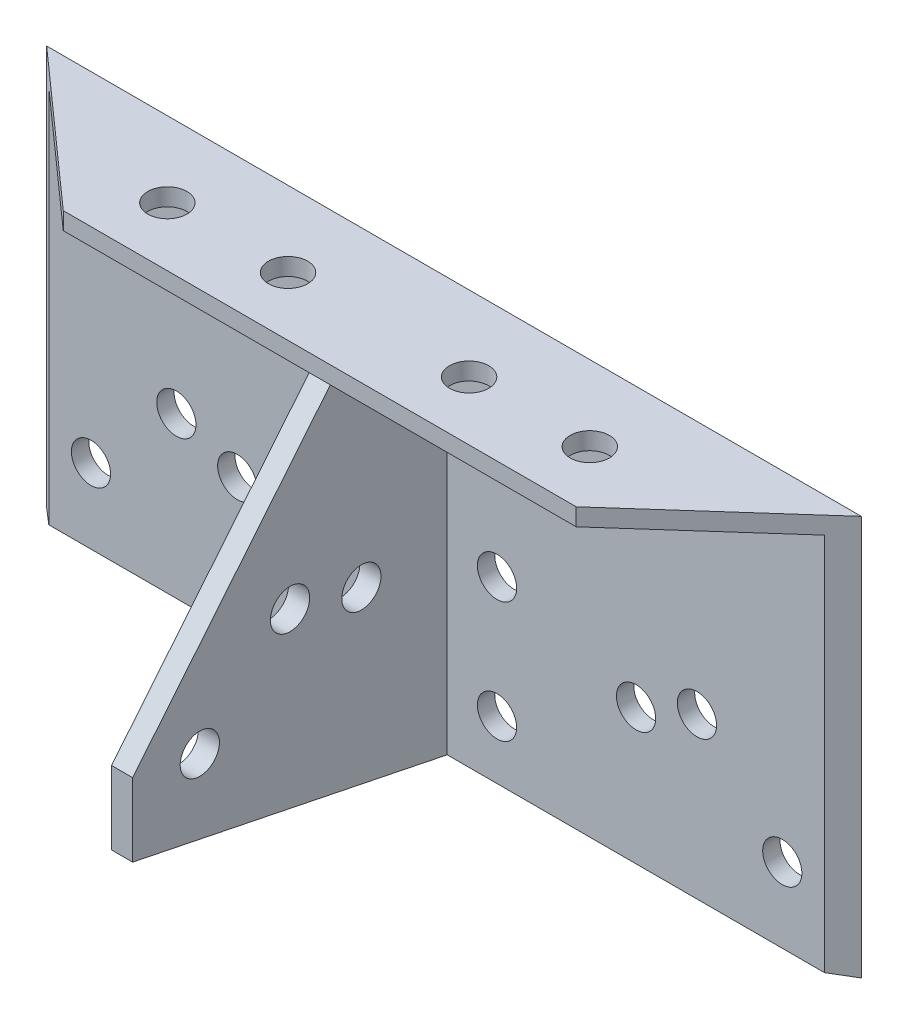
ISO-10303-21;
HEADER;
FILE_DESCRIPTION(('STEP AP214'),'2;1');
FILE_NAME('part.step','',(''),(''),'','','');
FILE_SCHEMA(('AUTOMOTIVE_DESIGN { 1 0 10303 214 1 1 1 1 }'));
ENDSEC;
DATA;
#1=APPLICATION_CONTEXT('core data for automotive mechanical design processes');
#2=APPLICATION_PROTOCOL_DEFINITION('international standard','automotive_design',2000,#1);
#3=PRODUCT_CONTEXT('',#1,'mechanical');
#4=PRODUCT('Part','Part','',(#3));
#5=PRODUCT_RELATED_PRODUCT_CATEGORY('part','',(#4));
#6=PRODUCT_DEFINITION_FORMATION('','',#4);
#7=PRODUCT_DEFINITION_CONTEXT('part definition',#1,'design');
#8=PRODUCT_DEFINITION('design','',#6,#7);
#9=PRODUCT_DEFINITION_SHAPE('','',#8);
#10=(LENGTH_UNIT() NAMED_UNIT(*) SI_UNIT(.MILLI.,.METRE.));
#11=(NAMED_UNIT(*) PLANE_ANGLE_UNIT() SI_UNIT($,.RADIAN.));
#12=(NAMED_UNIT(*) SI_UNIT($,.STERADIAN.) SOLID_ANGLE_UNIT());
#13=UNCERTAINTY_MEASURE_WITH_UNIT(LENGTH_MEASURE(1.E-05),#10,'distance_accuracy_value','');
#14=(GEOMETRIC_REPRESENTATION_CONTEXT(3) GLOBAL_UNCERTAINTY_ASSIGNED_CONTEXT((#13)) GLOBAL_UNIT_ASSIGNED_CONTEXT((#10,
#11,#12)) REPRESENTATION_CONTEXT('',''));
#15=CARTESIAN_POINT('',(0.,0.,0.));
#16=DIRECTION('',(0.,0.,1.));
#17=DIRECTION('',(1.,0.,0.));
#18=AXIS2_PLACEMENT_3D('',#15,#16,#17);
#19=CARTESIAN_POINT('',(0.,265.,11.5));
#20=DIRECTION('',(0.,0.,-1.));
#21=DIRECTION('',(-1.,0.,0.));
#22=AXIS2_PLACEMENT_3D('',#19,#20,#21);
#23=PLANE('',#22);
#24=CARTESIAN_POINT('',(97.4659453904821,108.465945390483,11.5));
#25=DIRECTION('',(0.,0.,1.));
#26=DIRECTION('',(1.,0.,0.));
#27=AXIS2_PLACEMENT_3D('',#24,#25,#26);
#28=CIRCLE('',#27,13.);
#29=CARTESIAN_POINT('',(110.465945390482,108.465945390483,11.5));
#30=VERTEX_POINT('',#29);
#31=EDGE_CURVE('E288',#30,#30,#28,.T.);
#32=ORIENTED_EDGE('',*,*,#31,.F.);
#33=EDGE_LOOP('',(#32));
#34=FACE_BOUND('',#33,.T.);
#35=CARTESIAN_POINT('',(40.8974028955581,51.897402895559,11.5));
#36=DIRECTION('',(0.,0.,1.));
#37=DIRECTION('',(1.,0.,0.));
#38=AXIS2_PLACEMENT_3D('',#35,#36,#37);
#39=CIRCLE('',#38,13.);
#40=CARTESIAN_POINT('',(53.8974028955582,51.897402895559,11.5));
#41=VERTEX_POINT('',#40);
#42=EDGE_CURVE('E282',#41,#41,#39,.T.);
#43=ORIENTED_EDGE('',*,*,#42,.F.);
#44=EDGE_LOOP('',(#43));
#45=FACE_BOUND('',#44,.T.);
#46=CARTESIAN_POINT('',(230.,121.,11.5));
#47=DIRECTION('',(0.,0.,1.));
#48=DIRECTION('',(1.,0.,0.));
#49=AXIS2_PLACEMENT_3D('',#46,#47,#48);
#50=CIRCLE('',#49,13.);
#51=CARTESIAN_POINT('',(243.,121.,11.5));
#52=VERTEX_POINT('',#51);
#53=EDGE_CURVE('E270',#52,#52,#50,.T.);
#54=ORIENTED_EDGE('',*,*,#53,.F.);
#55=EDGE_LOOP('',(#54));
#56=FACE_BOUND('',#55,.T.);
#57=CARTESIAN_POINT('',(230.,41.,11.5));
#58=DIRECTION('',(0.,0.,1.));
#59=DIRECTION('',(1.,0.,0.));
#60=AXIS2_PLACEMENT_3D('',#57,#58,#59);
#61=CIRCLE('',#60,13.);
#62=CARTESIAN_POINT('',(243.,41.,11.5));
#63=VERTEX_POINT('',#62);
#64=EDGE_CURVE('E264',#63,#63,#61,.T.);
#65=ORIENTED_EDGE('',*,*,#64,.F.);
#66=EDGE_LOOP('',(#65));
#67=FACE_BOUND('',#66,.T.);
#68=CARTESIAN_POINT('',(137.829012361263,92.2615340814046,11.5));
#69=DIRECTION('',(0.,0.,1.));
#70=DIRECTION('',(1.,0.,0.));
#71=AXIS2_PLACEMENT_3D('',#68,#69,#70);
#72=CIRCLE('',#71,13.);
#73=CARTESIAN_POINT('',(150.829012361263,92.2615340814046,11.5));
#74=VERTEX_POINT('',#73);
#75=EDGE_CURVE('E246',#74,#74,#72,.T.);
#76=ORIENTED_EDGE('',*,*,#75,.F.);
#77=EDGE_LOOP('',(#76));
#78=FACE_BOUND('',#77,.T.);
#79=DIRECTION('',(0.,-1.,0.));
#80=VECTOR('',#79,1.);
#81=CARTESIAN_POINT('',(12.9213483146067,265.,11.5));
#82=LINE('',#81,#80);
#83=CARTESIAN_POINT('',(12.9213483146067,253.5,11.5));
#84=VERTEX_POINT('',#83);
#85=CARTESIAN_POINT('',(12.9213483146067,2.35227272727279,11.5));
#86=VERTEX_POINT('',#85);
#87=EDGE_CURVE('E219',#84,#86,#82,.T.);
#88=ORIENTED_EDGE('',*,*,#87,.T.);
#89=DIRECTION('',(1.,0.,0.));
#90=VECTOR('',#89,1.);
#91=CARTESIAN_POINT('',(0.,2.35227272727279,11.5));
#92=LINE('',#91,#90);
#93=CARTESIAN_POINT('',(263.,2.35227272727273,11.5));
#94=VERTEX_POINT('',#93);
#95=EDGE_CURVE('E320',#86,#94,#92,.T.);
#96=ORIENTED_EDGE('',*,*,#95,.T.);
#97=DIRECTION('',(0.,-1.,0.));
#98=VECTOR('',#97,1.);
#99=CARTESIAN_POINT('',(263.,253.5,11.5));
#100=LINE('',#99,#98);
#101=CARTESIAN_POINT('',(263.,253.5,11.5));
#102=VERTEX_POINT('',#101);
#103=EDGE_CURVE('E193',#102,#94,#100,.T.);
#104=ORIENTED_EDGE('',*,*,#103,.F.);
#105=DIRECTION('',(1.,0.,0.));
#106=VECTOR('',#105,1.);
#107=CARTESIAN_POINT('',(0.,253.5,11.5));
#108=LINE('',#107,#106);
#109=EDGE_CURVE('E231',#84,#102,#108,.T.);
#110=ORIENTED_EDGE('',*,*,#109,.F.);
#111=EDGE_LOOP('',(#88,#96,#104,#110));
#112=FACE_BOUND('',#111,.T.);
#113=ADVANCED_FACE('F35',(#34,#45,#56,#67,#78,#112),#23,.F.);
#114=CARTESIAN_POINT('',(499.102597104442,51.8974028955591,11.5));
#115=DIRECTION('',(0.,0.,1.));
#116=DIRECTION('',(-1.,0.,0.));
#117=AXIS2_PLACEMENT_3D('',#114,#115,#116);
#118=CIRCLE('',#117,13.0000000000001);
#119=CARTESIAN_POINT('',(486.102597104442,51.8974028955591,11.5));
#120=VERTEX_POINT('',#119);
#121=EDGE_CURVE('E276',#120,#120,#118,.T.);
#122=ORIENTED_EDGE('',*,*,#121,.F.);
#123=EDGE_LOOP('',(#122));
#124=FACE_BOUND('',#123,.T.);
#125=CARTESIAN_POINT('',(310.,41.,11.5));
#126=DIRECTION('',(0.,0.,1.));
#127=DIRECTION('',(-1.,0.,0.));
#128=AXIS2_PLACEMENT_3D('',#125,#126,#127);
#129=CIRCLE('',#128,13.);
#130=CARTESIAN_POINT('',(297.,41.,11.5));
#131=VERTEX_POINT('',#130);
#132=EDGE_CURVE('E258',#131,#131,#129,.T.);
#133=ORIENTED_EDGE('',*,*,#132,.F.);
#134=EDGE_LOOP('',(#133));
#135=FACE_BOUND('',#134,.T.);
#136=CARTESIAN_POINT('',(310.,121.,11.5));
#137=DIRECTION('',(0.,0.,1.));
#138=DIRECTION('',(-1.,0.,0.));
#139=AXIS2_PLACEMENT_3D('',#136,#137,#138);
#140=CIRCLE('',#139,13.);
#141=CARTESIAN_POINT('',(297.,121.,11.5));
#142=VERTEX_POINT('',#141);
#143=EDGE_CURVE('E252',#142,#142,#140,.T.);
#144=ORIENTED_EDGE('',*,*,#143,.F.);
#145=EDGE_LOOP('',(#144));
#146=FACE_BOUND('',#145,.T.);
#147=CARTESIAN_POINT('',(442.534054609518,108.465945390483,11.5));
#148=DIRECTION('',(0.,0.,1.));
#149=DIRECTION('',(-1.,0.,0.));
#150=AXIS2_PLACEMENT_3D('',#147,#148,#149);
#151=CIRCLE('',#150,13.);
#152=CARTESIAN_POINT('',(429.534054609518,108.465945390483,11.5));
#153=VERTEX_POINT('',#152);
#154=EDGE_CURVE('E240',#153,#153,#151,.T.);
#155=ORIENTED_EDGE('',*,*,#154,.F.);
#156=EDGE_LOOP('',(#155));
#157=FACE_BOUND('',#156,.T.);
#158=CARTESIAN_POINT('',(402.170987638737,92.2615340814046,11.5));
#159=DIRECTION('',(0.,0.,1.));
#160=DIRECTION('',(-1.,0.,0.));
#161=AXIS2_PLACEMENT_3D('',#158,#159,#160);
#162=CIRCLE('',#161,13.);
#163=CARTESIAN_POINT('',(389.170987638737,92.2615340814046,11.5));
#164=VERTEX_POINT('',#163);
#165=EDGE_CURVE('E234',#164,#164,#162,.T.);
#166=ORIENTED_EDGE('',*,*,#165,.F.);
#167=EDGE_LOOP('',(#166));
#168=FACE_BOUND('',#167,.T.);
#169=DIRECTION('',(0.,1.,0.));
#170=VECTOR('',#169,1.);
#171=CARTESIAN_POINT('',(277.,253.5,11.5));
#172=LINE('',#171,#170);
#173=CARTESIAN_POINT('',(277.,2.35227272727274,11.5000000000001));
#174=VERTEX_POINT('',#173);
#175=CARTESIAN_POINT('',(277.,253.5,11.5));
#176=VERTEX_POINT('',#175);
#177=EDGE_CURVE('E189',#174,#176,#172,.T.);
#178=ORIENTED_EDGE('',*,*,#177,.F.);
#179=DIRECTION('',(-1.,0.,0.));
#180=VECTOR('',#179,1.);
#181=CARTESIAN_POINT('',(540.,2.35227272727274,11.5000000000001));
#182=LINE('',#181,#180);
#183=CARTESIAN_POINT('',(527.078651685393,2.35227272727274,11.5000000000001));
#184=VERTEX_POINT('',#183);
#185=EDGE_CURVE('E136',#184,#174,#182,.T.);
#186=ORIENTED_EDGE('',*,*,#185,.F.);
#187=DIRECTION('',(0.,1.,0.));
#188=VECTOR('',#187,1.);
#189=CARTESIAN_POINT('',(527.078651685393,265.,11.5));
#190=LINE('',#189,#188);
#191=CARTESIAN_POINT('',(527.078651685393,253.5,11.5));
#192=VERTEX_POINT('',#191);
#193=EDGE_CURVE('E134',#184,#192,#190,.T.);
#194=ORIENTED_EDGE('',*,*,#193,.T.);
#195=EDGE_CURVE('E222',#176,#192,#108,.T.);
#196=ORIENTED_EDGE('',*,*,#195,.F.);
#197=EDGE_LOOP('',(#178,#186,#194,#196));
#198=FACE_BOUND('',#197,.T.);
#199=ADVANCED_FACE('F308',(#124,#135,#146,#157,#168,#198),#23,.F.);
#200=CARTESIAN_POINT('',(0.,253.5,89.));
#201=DIRECTION('',(0.,1.,0.));
#202=DIRECTION('',(0.,0.,1.));
#203=AXIS2_PLACEMENT_3D('',#200,#201,#202);
#204=PLANE('',#203);
#205=CARTESIAN_POINT('',(210.,253.5,50.));
#206=DIRECTION('',(0.,1.,0.));
#207=DIRECTION('',(0.,0.,1.));
#208=AXIS2_PLACEMENT_3D('',#205,#206,#207);
#209=CIRCLE('',#208,13.);
#210=CARTESIAN_POINT('',(210.,253.5,63.));
#211=VERTEX_POINT('',#210);
#212=EDGE_CURVE('E153',#211,#211,#209,.T.);
#213=ORIENTED_EDGE('',*,*,#212,.T.);
#214=EDGE_LOOP('',(#213));
#215=FACE_BOUND('',#214,.T.);
#216=CARTESIAN_POINT('',(130.,253.5,50.));
#217=DIRECTION('',(0.,1.,0.));
#218=DIRECTION('',(0.,0.,1.));
#219=AXIS2_PLACEMENT_3D('',#216,#217,#218);
#220=CIRCLE('',#219,13.);
#221=CARTESIAN_POINT('',(130.,253.5,63.));
#222=VERTEX_POINT('',#221);
#223=EDGE_CURVE('E165',#222,#222,#220,.T.);
#224=ORIENTED_EDGE('',*,*,#223,.T.);
#225=EDGE_LOOP('',(#224));
#226=FACE_BOUND('',#225,.T.);
#227=DIRECTION('',(0.,0.,-1.));
#228=VECTOR('',#227,1.);
#229=CARTESIAN_POINT('',(263.,253.5,220.));
#230=LINE('',#229,#228);
#231=CARTESIAN_POINT('',(263.,253.5,89.));
#232=VERTEX_POINT('',#231);
#233=EDGE_CURVE('E185',#232,#102,#230,.T.);
#234=ORIENTED_EDGE('',*,*,#233,.F.);
#235=DIRECTION('',(1.,0.,0.));
#236=VECTOR('',#235,1.);
#237=CARTESIAN_POINT('',(0.,253.5,89.));
#238=LINE('',#237,#236);
#239=CARTESIAN_POINT('',(100.,253.5,89.));
#240=VERTEX_POINT('',#239);
#241=EDGE_CURVE('E223',#240,#232,#238,.T.);
#242=ORIENTED_EDGE('',*,*,#241,.F.);
#243=DIRECTION('',(-0.746997038573461,0.,-0.66482736433038));
#244=VECTOR('',#243,1.);
#245=CARTESIAN_POINT('',(44.199542436248,253.5,39.3375927682607));
#246=LINE('',#245,#244);
#247=EDGE_CURVE('E216',#240,#84,#246,.T.);
#248=ORIENTED_EDGE('',*,*,#247,.T.);
#249=ORIENTED_EDGE('',*,*,#109,.T.);
#250=EDGE_LOOP('',(#234,#242,#248,#249));
#251=FACE_BOUND('',#250,.T.);
#252=ADVANCED_FACE('F355',(#215,#226,#251),#204,.F.);
#253=CARTESIAN_POINT('',(330.,253.5,50.));
#254=DIRECTION('',(0.,1.,0.));
#255=DIRECTION('',(0.,0.,1.));
#256=AXIS2_PLACEMENT_3D('',#253,#254,#255);
#257=CIRCLE('',#256,13.);
#258=CARTESIAN_POINT('',(330.,253.5,62.9999999999999));
#259=VERTEX_POINT('',#258);
#260=EDGE_CURVE('E158',#259,#259,#257,.T.);
#261=ORIENTED_EDGE('',*,*,#260,.T.);
#262=EDGE_LOOP('',(#261));
#263=FACE_BOUND('',#262,.T.);
#264=CARTESIAN_POINT('',(410.,253.5,50.));
#265=DIRECTION('',(0.,1.,0.));
#266=DIRECTION('',(0.,0.,1.));
#267=AXIS2_PLACEMENT_3D('',#264,#265,#266);
#268=CIRCLE('',#267,13.);
#269=CARTESIAN_POINT('',(410.,253.5,63.));
#270=VERTEX_POINT('',#269);
#271=EDGE_CURVE('E161',#270,#270,#268,.T.);
#272=ORIENTED_EDGE('',*,*,#271,.T.);
#273=EDGE_LOOP('',(#272));
#274=FACE_BOUND('',#273,.T.);
#275=DIRECTION('',(0.,0.,-1.));
#276=VECTOR('',#275,1.);
#277=CARTESIAN_POINT('',(277.,253.5,220.));
#278=LINE('',#277,#276);
#279=CARTESIAN_POINT('',(277.,253.5,89.));
#280=VERTEX_POINT('',#279);
#281=EDGE_CURVE('E180',#280,#176,#278,.T.);
#282=ORIENTED_EDGE('',*,*,#281,.T.);
#283=ORIENTED_EDGE('',*,*,#195,.T.);
#284=DIRECTION('',(-0.746997038573461,0.,0.66482736433038));
#285=VECTOR('',#284,1.);
#286=CARTESIAN_POINT('',(194.477986719491,253.5,307.514591819653));
#287=LINE('',#286,#285);
#288=CARTESIAN_POINT('',(440.,253.5,89.));
#289=VERTEX_POINT('',#288);
#290=EDGE_CURVE('E210',#192,#289,#287,.T.);
#291=ORIENTED_EDGE('',*,*,#290,.T.);
#292=EDGE_CURVE('E228',#280,#289,#238,.T.);
#293=ORIENTED_EDGE('',*,*,#292,.F.);
#294=EDGE_LOOP('',(#282,#283,#291,#293));
#295=FACE_BOUND('',#294,.T.);
#296=ADVANCED_FACE('F303',(#263,#274,#295),#204,.F.);
#297=CARTESIAN_POINT('',(0.,265.,0.));
#298=DIRECTION('',(0.,0.,-1.));
#299=DIRECTION('',(-1.,0.,0.));
#300=AXIS2_PLACEMENT_3D('',#297,#298,#299);
#301=PLANE('',#300);
#302=CARTESIAN_POINT('',(442.534054609518,108.465945390483,0.));
#303=DIRECTION('',(0.,0.,1.));
#304=DIRECTION('',(-1.,0.,0.));
#305=AXIS2_PLACEMENT_3D('',#302,#303,#304);
#306=CIRCLE('',#305,13.);
#307=CARTESIAN_POINT('',(429.534054609518,108.465945390483,0.));
#308=VERTEX_POINT('',#307);
#309=EDGE_CURVE('E237',#308,#308,#306,.T.);
#310=ORIENTED_EDGE('',*,*,#309,.T.);
#311=EDGE_LOOP('',(#310));
#312=FACE_BOUND('',#311,.T.);
#313=CARTESIAN_POINT('',(310.,121.,0.));
#314=DIRECTION('',(0.,0.,1.));
#315=DIRECTION('',(-1.,0.,0.));
#316=AXIS2_PLACEMENT_3D('',#313,#314,#315);
#317=CIRCLE('',#316,13.);
#318=CARTESIAN_POINT('',(297.,121.,0.));
#319=VERTEX_POINT('',#318);
#320=EDGE_CURVE('E249',#319,#319,#317,.T.);
#321=ORIENTED_EDGE('',*,*,#320,.T.);
#322=EDGE_LOOP('',(#321));
#323=FACE_BOUND('',#322,.T.);
#324=CARTESIAN_POINT('',(230.,41.,0.));
#325=DIRECTION('',(0.,0.,1.));
#326=DIRECTION('',(1.,0.,0.));
#327=AXIS2_PLACEMENT_3D('',#324,#325,#326);
#328=CIRCLE('',#327,13.);
#329=CARTESIAN_POINT('',(243.,41.,0.));
#330=VERTEX_POINT('',#329);
#331=EDGE_CURVE('E261',#330,#330,#328,.T.);
#332=ORIENTED_EDGE('',*,*,#331,.T.);
#333=EDGE_LOOP('',(#332));
#334=FACE_BOUND('',#333,.T.);
#335=CARTESIAN_POINT('',(499.102597104442,51.8974028955591,0.));
#336=DIRECTION('',(0.,0.,1.));
#337=DIRECTION('',(-1.,0.,0.));
#338=AXIS2_PLACEMENT_3D('',#335,#336,#337);
#339=CIRCLE('',#338,13.0000000000001);
#340=CARTESIAN_POINT('',(486.102597104442,51.8974028955591,0.));
#341=VERTEX_POINT('',#340);
#342=EDGE_CURVE('E273',#341,#341,#339,.T.);
#343=ORIENTED_EDGE('',*,*,#342,.T.);
#344=EDGE_LOOP('',(#343));
#345=FACE_BOUND('',#344,.T.);
#346=CARTESIAN_POINT('',(97.4659453904821,108.465945390483,0.));
#347=DIRECTION('',(0.,0.,1.));
#348=DIRECTION('',(1.,0.,0.));
#349=AXIS2_PLACEMENT_3D('',#346,#347,#348);
#350=CIRCLE('',#349,13.);
#351=CARTESIAN_POINT('',(110.465945390482,108.465945390483,0.));
#352=VERTEX_POINT('',#351);
#353=EDGE_CURVE('E285',#352,#352,#350,.T.);
#354=ORIENTED_EDGE('',*,*,#353,.T.);
#355=EDGE_LOOP('',(#354));
#356=FACE_BOUND('',#355,.T.);
#357=DIRECTION('',(0.,-1.,0.));
#358=VECTOR('',#357,1.);
#359=CARTESIAN_POINT('',(0.,0.,0.));
#360=LINE('',#359,#358);
#361=CARTESIAN_POINT('',(0.,265.,0.));
#362=VERTEX_POINT('',#361);
#363=CARTESIAN_POINT('',(0.,0.,0.));
#364=VERTEX_POINT('',#363);
#365=EDGE_CURVE('E127',#362,#364,#360,.T.);
#366=ORIENTED_EDGE('',*,*,#365,.F.);
#367=DIRECTION('',(-1.,0.,0.));
#368=VECTOR('',#367,1.);
#369=CARTESIAN_POINT('',(0.,265.,0.));
#370=LINE('',#369,#368);
#371=CARTESIAN_POINT('',(540.,265.,0.));
#372=VERTEX_POINT('',#371);
#373=EDGE_CURVE('E142',#372,#362,#370,.T.);
#374=ORIENTED_EDGE('',*,*,#373,.F.);
#375=DIRECTION('',(0.,1.,0.));
#376=VECTOR('',#375,1.);
#377=CARTESIAN_POINT('',(540.,0.,0.));
#378=LINE('',#377,#376);
#379=CARTESIAN_POINT('',(540.,0.,0.));
#380=VERTEX_POINT('',#379);
#381=EDGE_CURVE('E126',#380,#372,#378,.T.);
#382=ORIENTED_EDGE('',*,*,#381,.F.);
#383=DIRECTION('',(1.,0.,0.));
#384=VECTOR('',#383,1.);
#385=CARTESIAN_POINT('',(0.,0.,0.));
#386=LINE('',#385,#384);
#387=EDGE_CURVE('E115',#364,#380,#386,.T.);
#388=ORIENTED_EDGE('',*,*,#387,.F.);
#389=EDGE_LOOP('',(#366,#374,#382,#388));
#390=FACE_BOUND('',#389,.T.);
#391=CARTESIAN_POINT('',(40.8974028955581,51.897402895559,0.));
#392=DIRECTION('',(0.,0.,1.));
#393=DIRECTION('',(1.,0.,0.));
#394=AXIS2_PLACEMENT_3D('',#391,#392,#393);
#395=CIRCLE('',#394,13.);
#396=CARTESIAN_POINT('',(53.8974028955582,51.897402895559,0.));
#397=VERTEX_POINT('',#396);
#398=EDGE_CURVE('E279',#397,#397,#395,.T.);
#399=ORIENTED_EDGE('',*,*,#398,.T.);
#400=EDGE_LOOP('',(#399));
#401=FACE_BOUND('',#400,.T.);
#402=CARTESIAN_POINT('',(230.,121.,0.));
#403=DIRECTION('',(0.,0.,1.));
#404=DIRECTION('',(1.,0.,0.));
#405=AXIS2_PLACEMENT_3D('',#402,#403,#404);
#406=CIRCLE('',#405,13.);
#407=CARTESIAN_POINT('',(243.,121.,0.));
#408=VERTEX_POINT('',#407);
#409=EDGE_CURVE('E267',#408,#408,#406,.T.);
#410=ORIENTED_EDGE('',*,*,#409,.T.);
#411=EDGE_LOOP('',(#410));
#412=FACE_BOUND('',#411,.T.);
#413=CARTESIAN_POINT('',(310.,41.,0.));
#414=DIRECTION('',(0.,0.,1.));
#415=DIRECTION('',(-1.,0.,0.));
#416=AXIS2_PLACEMENT_3D('',#413,#414,#415);
#417=CIRCLE('',#416,13.);
#418=CARTESIAN_POINT('',(297.,41.,0.));
#419=VERTEX_POINT('',#418);
#420=EDGE_CURVE('E255',#419,#419,#417,.T.);
#421=ORIENTED_EDGE('',*,*,#420,.T.);
#422=EDGE_LOOP('',(#421));
#423=FACE_BOUND('',#422,.T.);
#424=CARTESIAN_POINT('',(137.829012361263,92.2615340814046,0.));
#425=DIRECTION('',(0.,0.,1.));
#426=DIRECTION('',(1.,0.,0.));
#427=AXIS2_PLACEMENT_3D('',#424,#425,#426);
#428=CIRCLE('',#427,13.);
#429=CARTESIAN_POINT('',(150.829012361263,92.2615340814046,0.));
#430=VERTEX_POINT('',#429);
#431=EDGE_CURVE('E243',#430,#430,#428,.T.);
#432=ORIENTED_EDGE('',*,*,#431,.T.);
#433=EDGE_LOOP('',(#432));
#434=FACE_BOUND('',#433,.T.);
#435=CARTESIAN_POINT('',(402.170987638737,92.2615340814046,0.));
#436=DIRECTION('',(0.,0.,1.));
#437=DIRECTION('',(-1.,0.,0.));
#438=AXIS2_PLACEMENT_3D('',#435,#436,#437);
#439=CIRCLE('',#438,13.);
#440=CARTESIAN_POINT('',(389.170987638737,92.2615340814046,0.));
#441=VERTEX_POINT('',#440);
#442=EDGE_CURVE('E230',#441,#441,#439,.T.);
#443=ORIENTED_EDGE('',*,*,#442,.T.);
#444=EDGE_LOOP('',(#443));
#445=FACE_BOUND('',#444,.T.);
#446=ADVANCED_FACE('F139',(#312,#323,#334,#345,#356,#390,#401,#412,#423,#434,#445),#301,.T.);
#447=CARTESIAN_POINT('',(0.,265.,11.5));
#448=DIRECTION('',(0.,-1.,0.));
#449=DIRECTION('',(0.,0.,-1.));
#450=AXIS2_PLACEMENT_3D('',#447,#448,#449);
#451=PLANE('',#450);
#452=CARTESIAN_POINT('',(130.,265.,50.));
#453=DIRECTION('',(0.,1.,0.));
#454=DIRECTION('',(0.,0.,1.));
#455=AXIS2_PLACEMENT_3D('',#452,#453,#454);
#456=CIRCLE('',#455,13.);
#457=CARTESIAN_POINT('',(130.,265.,63.));
#458=VERTEX_POINT('',#457);
#459=EDGE_CURVE('E162',#458,#458,#456,.T.);
#460=ORIENTED_EDGE('',*,*,#459,.F.);
#461=EDGE_LOOP('',(#460));
#462=FACE_BOUND('',#461,.T.);
#463=CARTESIAN_POINT('',(410.,265.,50.));
#464=DIRECTION('',(0.,1.,0.));
#465=DIRECTION('',(0.,0.,-1.));
#466=AXIS2_PLACEMENT_3D('',#463,#464,#465);
#467=CIRCLE('',#466,13.);
#468=CARTESIAN_POINT('',(410.,265.,37.));
#469=VERTEX_POINT('',#468);
#470=EDGE_CURVE('E202',#469,#469,#467,.T.);
#471=ORIENTED_EDGE('',*,*,#470,.F.);
#472=EDGE_LOOP('',(#471));
#473=FACE_BOUND('',#472,.T.);
#474=CARTESIAN_POINT('',(330.,265.,50.));
#475=DIRECTION('',(0.,1.,0.));
#476=DIRECTION('',(0.,0.,-1.));
#477=AXIS2_PLACEMENT_3D('',#474,#475,#476);
#478=CIRCLE('',#477,13.);
#479=CARTESIAN_POINT('',(330.,265.,37.));
#480=VERTEX_POINT('',#479);
#481=EDGE_CURVE('E199',#480,#480,#478,.T.);
#482=ORIENTED_EDGE('',*,*,#481,.F.);
#483=EDGE_LOOP('',(#482));
#484=FACE_BOUND('',#483,.T.);
#485=CARTESIAN_POINT('',(210.,265.,50.));
#486=DIRECTION('',(0.,1.,0.));
#487=DIRECTION('',(0.,0.,1.));
#488=AXIS2_PLACEMENT_3D('',#485,#486,#487);
#489=CIRCLE('',#488,13.);
#490=CARTESIAN_POINT('',(210.,265.,63.));
#491=VERTEX_POINT('',#490);
#492=EDGE_CURVE('E157',#491,#491,#489,.T.);
#493=ORIENTED_EDGE('',*,*,#492,.F.);
#494=EDGE_LOOP('',(#493));
#495=FACE_BOUND('',#494,.T.);
#496=DIRECTION('',(-1.,0.,0.));
#497=VECTOR('',#496,1.);
#498=CARTESIAN_POINT('',(0.,265.,89.));
#499=LINE('',#498,#497);
#500=CARTESIAN_POINT('',(440.,265.,89.));
#501=VERTEX_POINT('',#500);
#502=CARTESIAN_POINT('',(100.,265.,89.));
#503=VERTEX_POINT('',#502);
#504=EDGE_CURVE('E226',#501,#503,#499,.T.);
#505=ORIENTED_EDGE('',*,*,#504,.F.);
#506=DIRECTION('',(-0.746997038573461,0.,0.66482736433038));
#507=VECTOR('',#506,1.);
#508=CARTESIAN_POINT('',(540.,265.,0.));
#509=LINE('',#508,#507);
#510=EDGE_CURVE('E156',#372,#501,#509,.T.);
#511=ORIENTED_EDGE('',*,*,#510,.F.);
#512=ORIENTED_EDGE('',*,*,#373,.T.);
#513=DIRECTION('',(-0.746997038573461,0.,-0.66482736433038));
#514=VECTOR('',#513,1.);
#515=CARTESIAN_POINT('',(0.,265.,0.));
#516=LINE('',#515,#514);
#517=EDGE_CURVE('E214',#503,#362,#516,.T.);
#518=ORIENTED_EDGE('',*,*,#517,.F.);
#519=EDGE_LOOP('',(#505,#511,#512,#518));
#520=FACE_BOUND('',#519,.T.);
#521=ADVANCED_FACE('F37',(#462,#473,#484,#495,#520),#451,.F.);
#522=CARTESIAN_POINT('',(97.4659453904821,108.465945390483,11.5));
#523=DIRECTION('',(0.,0.,-1.));
#524=DIRECTION('',(-1.,0.,0.));
#525=AXIS2_PLACEMENT_3D('',#522,#523,#524);
#526=CYLINDRICAL_SURFACE('',#525,13.);
#527=ORIENTED_EDGE('',*,*,#31,.T.);
#528=EDGE_LOOP('',(#527));
#529=FACE_BOUND('',#528,.T.);
#530=ORIENTED_EDGE('',*,*,#353,.F.);
#531=EDGE_LOOP('',(#530));
#532=FACE_BOUND('',#531,.T.);
#533=ADVANCED_FACE('F360',(#529,#532),#526,.F.);
#534=CARTESIAN_POINT('',(40.8974028955581,51.897402895559,11.5));
#535=DIRECTION('',(0.,0.,-1.));
#536=DIRECTION('',(-1.,0.,0.));
#537=AXIS2_PLACEMENT_3D('',#534,#535,#536);
#538=CYLINDRICAL_SURFACE('',#537,13.);
#539=ORIENTED_EDGE('',*,*,#42,.T.);
#540=EDGE_LOOP('',(#539));
#541=FACE_BOUND('',#540,.T.);
#542=ORIENTED_EDGE('',*,*,#398,.F.);
#543=EDGE_LOOP('',(#542));
#544=FACE_BOUND('',#543,.T.);
#545=ADVANCED_FACE('F382',(#541,#544),#538,.F.);
#546=CARTESIAN_POINT('',(499.102597104442,51.8974028955591,11.5));
#547=DIRECTION('',(0.,0.,-1.));
#548=DIRECTION('',(-1.,0.,0.));
#549=AXIS2_PLACEMENT_3D('',#546,#547,#548);
#550=CYLINDRICAL_SURFACE('',#549,13.0000000000001);
#551=ORIENTED_EDGE('',*,*,#121,.T.);
#552=EDGE_LOOP('',(#551));
#553=FACE_BOUND('',#552,.T.);
#554=ORIENTED_EDGE('',*,*,#342,.F.);
#555=EDGE_LOOP('',(#554));
#556=FACE_BOUND('',#555,.T.);
#557=ADVANCED_FACE('F387',(#553,#556),#550,.F.);
#558=CARTESIAN_POINT('',(230.,121.,11.5));
#559=DIRECTION('',(0.,0.,-1.));
#560=DIRECTION('',(-1.,0.,0.));
#561=AXIS2_PLACEMENT_3D('',#558,#559,#560);
#562=CYLINDRICAL_SURFACE('',#561,13.);
#563=ORIENTED_EDGE('',*,*,#53,.T.);
#564=EDGE_LOOP('',(#563));
#565=FACE_BOUND('',#564,.T.);
#566=ORIENTED_EDGE('',*,*,#409,.F.);
#567=EDGE_LOOP('',(#566));
#568=FACE_BOUND('',#567,.T.);
#569=ADVANCED_FACE('F392',(#565,#568),#562,.F.);
#570=CARTESIAN_POINT('',(230.,41.,11.5));
#571=DIRECTION('',(0.,0.,-1.));
#572=DIRECTION('',(-1.,0.,0.));
#573=AXIS2_PLACEMENT_3D('',#570,#571,#572);
#574=CYLINDRICAL_SURFACE('',#573,13.);
#575=ORIENTED_EDGE('',*,*,#64,.T.);
#576=EDGE_LOOP('',(#575));
#577=FACE_BOUND('',#576,.T.);
#578=ORIENTED_EDGE('',*,*,#331,.F.);
#579=EDGE_LOOP('',(#578));
#580=FACE_BOUND('',#579,.T.);
#581=ADVANCED_FACE('F399',(#577,#580),#574,.F.);
#582=CARTESIAN_POINT('',(310.,41.,11.5));
#583=DIRECTION('',(0.,0.,-1.));
#584=DIRECTION('',(-1.,0.,0.));
#585=AXIS2_PLACEMENT_3D('',#582,#583,#584);
#586=CYLINDRICAL_SURFACE('',#585,13.);
#587=ORIENTED_EDGE('',*,*,#132,.T.);
#588=EDGE_LOOP('',(#587));
#589=FACE_BOUND('',#588,.T.);
#590=ORIENTED_EDGE('',*,*,#420,.F.);
#591=EDGE_LOOP('',(#590));
#592=FACE_BOUND('',#591,.T.);
#593=ADVANCED_FACE('F403',(#589,#592),#586,.F.);
#594=CARTESIAN_POINT('',(310.,121.,11.5));
#595=DIRECTION('',(0.,0.,-1.));
#596=DIRECTION('',(-1.,0.,0.));
#597=AXIS2_PLACEMENT_3D('',#594,#595,#596);
#598=CYLINDRICAL_SURFACE('',#597,13.);
#599=ORIENTED_EDGE('',*,*,#143,.T.);
#600=EDGE_LOOP('',(#599));
#601=FACE_BOUND('',#600,.T.);
#602=ORIENTED_EDGE('',*,*,#320,.F.);
#603=EDGE_LOOP('',(#602));
#604=FACE_BOUND('',#603,.T.);
#605=ADVANCED_FACE('F407',(#601,#604),#598,.F.);
#606=CARTESIAN_POINT('',(137.829012361263,92.2615340814046,11.5));
#607=DIRECTION('',(0.,0.,-1.));
#608=DIRECTION('',(-1.,0.,0.));
#609=AXIS2_PLACEMENT_3D('',#606,#607,#608);
#610=CYLINDRICAL_SURFACE('',#609,13.);
#611=ORIENTED_EDGE('',*,*,#75,.T.);
#612=EDGE_LOOP('',(#611));
#613=FACE_BOUND('',#612,.T.);
#614=ORIENTED_EDGE('',*,*,#431,.F.);
#615=EDGE_LOOP('',(#614));
#616=FACE_BOUND('',#615,.T.);
#617=ADVANCED_FACE('F411',(#613,#616),#610,.F.);
#618=CARTESIAN_POINT('',(442.534054609518,108.465945390483,11.5));
#619=DIRECTION('',(0.,0.,-1.));
#620=DIRECTION('',(-1.,0.,0.));
#621=AXIS2_PLACEMENT_3D('',#618,#619,#620);
#622=CYLINDRICAL_SURFACE('',#621,13.);
#623=ORIENTED_EDGE('',*,*,#154,.T.);
#624=EDGE_LOOP('',(#623));
#625=FACE_BOUND('',#624,.T.);
#626=ORIENTED_EDGE('',*,*,#309,.F.);
#627=EDGE_LOOP('',(#626));
#628=FACE_BOUND('',#627,.T.);
#629=ADVANCED_FACE('F415',(#625,#628),#622,.F.);
#630=CARTESIAN_POINT('',(402.170987638737,92.2615340814046,11.5));
#631=DIRECTION('',(0.,0.,-1.));
#632=DIRECTION('',(-1.,0.,0.));
#633=AXIS2_PLACEMENT_3D('',#630,#631,#632);
#634=CYLINDRICAL_SURFACE('',#633,13.);
#635=ORIENTED_EDGE('',*,*,#165,.T.);
#636=EDGE_LOOP('',(#635));
#637=FACE_BOUND('',#636,.T.);
#638=ORIENTED_EDGE('',*,*,#442,.F.);
#639=EDGE_LOOP('',(#638));
#640=FACE_BOUND('',#639,.T.);
#641=ADVANCED_FACE('F419',(#637,#640),#634,.F.);
#642=CARTESIAN_POINT('',(0.,253.5,89.));
#643=DIRECTION('',(0.,0.,1.));
#644=DIRECTION('',(1.,0.,0.));
#645=AXIS2_PLACEMENT_3D('',#642,#643,#644);
#646=PLANE('',#645);
#647=DIRECTION('',(0.,-1.,0.));
#648=VECTOR('',#647,1.);
#649=CARTESIAN_POINT('',(440.,253.5,89.));
#650=LINE('',#649,#648);
#651=EDGE_CURVE('E150',#501,#289,#650,.T.);
#652=ORIENTED_EDGE('',*,*,#651,.F.);
#653=ORIENTED_EDGE('',*,*,#504,.T.);
#654=DIRECTION('',(0.,1.,0.));
#655=VECTOR('',#654,1.);
#656=CARTESIAN_POINT('',(100.,253.5,89.));
#657=LINE('',#656,#655);
#658=EDGE_CURVE('E144',#240,#503,#657,.T.);
#659=ORIENTED_EDGE('',*,*,#658,.F.);
#660=ORIENTED_EDGE('',*,*,#241,.T.);
#661=EDGE_CURVE('E227',#232,#280,#238,.T.);
#662=ORIENTED_EDGE('',*,*,#661,.T.);
#663=ORIENTED_EDGE('',*,*,#292,.T.);
#664=EDGE_LOOP('',(#652,#653,#659,#660,#662,#663));
#665=FACE_BOUND('',#664,.T.);
#666=ADVANCED_FACE('F300',(#665),#646,.T.);
#667=CARTESIAN_POINT('',(0.,0.,0.));
#668=DIRECTION('',(0.66482736433038,0.,-0.746997038573461));
#669=DIRECTION('',(-0.746997038573461,0.,-0.66482736433038));
#670=AXIS2_PLACEMENT_3D('',#667,#668,#669);
#671=PLANE('',#670);
#672=ORIENTED_EDGE('',*,*,#365,.T.);
#673=DIRECTION('',(0.740184431111828,0.134747211209222,0.658764143689527));
#674=VECTOR('',#673,1.);
#675=CARTESIAN_POINT('',(0.,0.,0.));
#676=LINE('',#675,#674);
#677=EDGE_CURVE('E121',#364,#86,#676,.T.);
#678=ORIENTED_EDGE('',*,*,#677,.T.);
#679=ORIENTED_EDGE('',*,*,#87,.F.);
#680=ORIENTED_EDGE('',*,*,#247,.F.);
#681=ORIENTED_EDGE('',*,*,#658,.T.);
#682=ORIENTED_EDGE('',*,*,#517,.T.);
#683=EDGE_LOOP('',(#672,#678,#679,#680,#681,#682));
#684=FACE_BOUND('',#683,.T.);
#685=ADVANCED_FACE('F293',(#684),#671,.F.);
#686=CARTESIAN_POINT('',(540.,0.,0.));
#687=DIRECTION('',(-0.66482736433038,0.,-0.746997038573461));
#688=DIRECTION('',(-0.746997038573461,0.,0.66482736433038));
#689=AXIS2_PLACEMENT_3D('',#686,#687,#688);
#690=PLANE('',#689);
#691=ORIENTED_EDGE('',*,*,#193,.F.);
#692=DIRECTION('',(0.740184431111828,-0.134747211209221,-0.658764143689527));
#693=VECTOR('',#692,1.);
#694=CARTESIAN_POINT('',(540.,0.,0.));
#695=LINE('',#694,#693);
#696=EDGE_CURVE('E118',#184,#380,#695,.T.);
#697=ORIENTED_EDGE('',*,*,#696,.T.);
#698=ORIENTED_EDGE('',*,*,#381,.T.);
#699=ORIENTED_EDGE('',*,*,#510,.T.);
#700=ORIENTED_EDGE('',*,*,#651,.T.);
#701=ORIENTED_EDGE('',*,*,#290,.F.);
#702=EDGE_LOOP('',(#691,#697,#698,#699,#700,#701));
#703=FACE_BOUND('',#702,.T.);
#704=ADVANCED_FACE('F131',(#703),#690,.F.);
#705=CARTESIAN_POINT('',(210.,0.,50.));
#706=DIRECTION('',(0.,1.,0.));
#707=DIRECTION('',(0.,0.,1.));
#708=AXIS2_PLACEMENT_3D('',#705,#706,#707);
#709=CYLINDRICAL_SURFACE('',#708,13.);
#710=ORIENTED_EDGE('',*,*,#492,.T.);
#711=EDGE_LOOP('',(#710));
#712=FACE_BOUND('',#711,.T.);
#713=ORIENTED_EDGE('',*,*,#212,.F.);
#714=EDGE_LOOP('',(#713));
#715=FACE_BOUND('',#714,.T.);
#716=ADVANCED_FACE('F432',(#712,#715),#709,.F.);
#717=CARTESIAN_POINT('',(330.,0.,50.));
#718=DIRECTION('',(0.,1.,0.));
#719=DIRECTION('',(0.,0.,1.));
#720=AXIS2_PLACEMENT_3D('',#717,#718,#719);
#721=CYLINDRICAL_SURFACE('',#720,13.);
#722=ORIENTED_EDGE('',*,*,#481,.T.);
#723=EDGE_LOOP('',(#722));
#724=FACE_BOUND('',#723,.T.);
#725=ORIENTED_EDGE('',*,*,#260,.F.);
#726=EDGE_LOOP('',(#725));
#727=FACE_BOUND('',#726,.T.);
#728=ADVANCED_FACE('F435',(#724,#727),#721,.F.);
#729=CARTESIAN_POINT('',(410.,0.,50.));
#730=DIRECTION('',(0.,1.,0.));
#731=DIRECTION('',(0.,0.,1.));
#732=AXIS2_PLACEMENT_3D('',#729,#730,#731);
#733=CYLINDRICAL_SURFACE('',#732,13.);
#734=ORIENTED_EDGE('',*,*,#470,.T.);
#735=EDGE_LOOP('',(#734));
#736=FACE_BOUND('',#735,.T.);
#737=ORIENTED_EDGE('',*,*,#271,.F.);
#738=EDGE_LOOP('',(#737));
#739=FACE_BOUND('',#738,.T.);
#740=ADVANCED_FACE('F439',(#736,#739),#733,.F.);
#741=CARTESIAN_POINT('',(130.,0.,50.));
#742=DIRECTION('',(0.,1.,0.));
#743=DIRECTION('',(0.,0.,1.));
#744=AXIS2_PLACEMENT_3D('',#741,#742,#743);
#745=CYLINDRICAL_SURFACE('',#744,13.);
#746=ORIENTED_EDGE('',*,*,#459,.T.);
#747=EDGE_LOOP('',(#746));
#748=FACE_BOUND('',#747,.T.);
#749=ORIENTED_EDGE('',*,*,#223,.F.);
#750=EDGE_LOOP('',(#749));
#751=FACE_BOUND('',#750,.T.);
#752=ADVANCED_FACE('F443',(#748,#751),#745,.F.);
#753=CARTESIAN_POINT('',(263.,253.5,220.));
#754=DIRECTION('',(1.,0.,0.));
#755=DIRECTION('',(0.,1.,0.));
#756=AXIS2_PLACEMENT_3D('',#753,#754,#755);
#757=PLANE('',#756);
#758=CARTESIAN_POINT('',(263.,126.937989210427,68.4004213366659));
#759=DIRECTION('',(1.,0.,0.));
#760=DIRECTION('',(0.,1.,0.));
#761=AXIS2_PLACEMENT_3D('',#758,#759,#760);
#762=CIRCLE('',#761,13.);
#763=CARTESIAN_POINT('',(263.,139.937989210427,68.4004213366659));
#764=VERTEX_POINT('',#763);
#765=EDGE_CURVE('E327',#764,#764,#762,.T.);
#766=ORIENTED_EDGE('',*,*,#765,.T.);
#767=EDGE_LOOP('',(#766));
#768=FACE_BOUND('',#767,.T.);
#769=CARTESIAN_POINT('',(263.,85.0126675451734,175.48574901168));
#770=DIRECTION('',(1.,0.,0.));
#771=DIRECTION('',(0.,1.,0.));
#772=AXIS2_PLACEMENT_3D('',#769,#770,#771);
#773=CIRCLE('',#772,13.);
#774=CARTESIAN_POINT('',(263.,98.0126675451733,175.48574901168));
#775=VERTEX_POINT('',#774);
#776=EDGE_CURVE('E324',#775,#775,#773,.T.);
#777=ORIENTED_EDGE('',*,*,#776,.T.);
#778=EDGE_LOOP('',(#777));
#779=FACE_BOUND('',#778,.T.);
#780=CARTESIAN_POINT('',(263.,138.161774651567,115.693003516987));
#781=DIRECTION('',(1.,0.,0.));
#782=DIRECTION('',(0.,1.,0.));
#783=AXIS2_PLACEMENT_3D('',#780,#781,#782);
#784=CIRCLE('',#783,13.);
#785=CARTESIAN_POINT('',(263.,151.161774651567,115.693003516987));
#786=VERTEX_POINT('',#785);
#787=EDGE_CURVE('E196',#786,#786,#784,.T.);
#788=ORIENTED_EDGE('',*,*,#787,.T.);
#789=EDGE_LOOP('',(#788));
#790=FACE_BOUND('',#789,.T.);
#791=ORIENTED_EDGE('',*,*,#103,.T.);
#792=DIRECTION('',(0.,0.200396236148707,0.979714932282566));
#793=VECTOR('',#792,1.);
#794=CARTESIAN_POINT('',(263.,53.3730788299455,260.935052057511));
#795=LINE('',#794,#793);
#796=CARTESIAN_POINT('',(263.,45.,220.));
#797=VERTEX_POINT('',#796);
#798=EDGE_CURVE('E317',#94,#797,#795,.T.);
#799=ORIENTED_EDGE('',*,*,#798,.T.);
#800=DIRECTION('',(0.,-1.,0.));
#801=VECTOR('',#800,1.);
#802=CARTESIAN_POINT('',(263.,253.5,220.));
#803=LINE('',#802,#801);
#804=CARTESIAN_POINT('',(263.,93.5,220.));
#805=VERTEX_POINT('',#804);
#806=EDGE_CURVE('E186',#805,#797,#803,.T.);
#807=ORIENTED_EDGE('',*,*,#806,.F.);
#808=DIRECTION('',(0.,0.773741794125483,-0.633501093940239));
#809=VECTOR('',#808,1.);
#810=CARTESIAN_POINT('',(263.,189.288218236243,141.573396319076));
#811=LINE('',#810,#809);
#812=EDGE_CURVE('E57',#805,#232,#811,.T.);
#813=ORIENTED_EDGE('',*,*,#812,.T.);
#814=ORIENTED_EDGE('',*,*,#233,.T.);
#815=EDGE_LOOP('',(#791,#799,#807,#813,#814));
#816=FACE_BOUND('',#815,.T.);
#817=ADVANCED_FACE('F335',(#768,#779,#790,#816),#757,.F.);
#818=CARTESIAN_POINT('',(277.,253.5,220.));
#819=DIRECTION('',(-1.,0.,0.));
#820=DIRECTION('',(0.,0.,1.));
#821=AXIS2_PLACEMENT_3D('',#818,#819,#820);
#822=PLANE('',#821);
#823=CARTESIAN_POINT('',(277.,126.937989210427,68.4004213366659));
#824=DIRECTION('',(1.,0.,0.));
#825=DIRECTION('',(0.,0.,-1.));
#826=AXIS2_PLACEMENT_3D('',#823,#824,#825);
#827=CIRCLE('',#826,13.);
#828=CARTESIAN_POINT('',(277.,126.937989210427,55.4004213366659));
#829=VERTEX_POINT('',#828);
#830=EDGE_CURVE('E135',#829,#829,#827,.T.);
#831=ORIENTED_EDGE('',*,*,#830,.F.);
#832=EDGE_LOOP('',(#831));
#833=FACE_BOUND('',#832,.T.);
#834=CARTESIAN_POINT('',(277.,85.0126675451734,175.48574901168));
#835=DIRECTION('',(1.,0.,0.));
#836=DIRECTION('',(0.,0.,-1.));
#837=AXIS2_PLACEMENT_3D('',#834,#835,#836);
#838=CIRCLE('',#837,13.);
#839=CARTESIAN_POINT('',(277.,85.0126675451734,162.48574901168));
#840=VERTEX_POINT('',#839);
#841=EDGE_CURVE('E182',#840,#840,#838,.T.);
#842=ORIENTED_EDGE('',*,*,#841,.F.);
#843=EDGE_LOOP('',(#842));
#844=FACE_BOUND('',#843,.T.);
#845=CARTESIAN_POINT('',(277.,138.161774651567,115.693003516987));
#846=DIRECTION('',(1.,0.,0.));
#847=DIRECTION('',(0.,0.,-1.));
#848=AXIS2_PLACEMENT_3D('',#845,#846,#847);
#849=CIRCLE('',#848,13.);
#850=CARTESIAN_POINT('',(277.,138.161774651567,102.693003516987));
#851=VERTEX_POINT('',#850);
#852=EDGE_CURVE('E330',#851,#851,#849,.T.);
#853=ORIENTED_EDGE('',*,*,#852,.F.);
#854=EDGE_LOOP('',(#853));
#855=FACE_BOUND('',#854,.T.);
#856=DIRECTION('',(0.,1.,0.));
#857=VECTOR('',#856,1.);
#858=CARTESIAN_POINT('',(277.,253.5,220.));
#859=LINE('',#858,#857);
#860=CARTESIAN_POINT('',(277.,45.,220.));
#861=VERTEX_POINT('',#860);
#862=CARTESIAN_POINT('',(277.,93.5,220.));
#863=VERTEX_POINT('',#862);
#864=EDGE_CURVE('E178',#861,#863,#859,.T.);
#865=ORIENTED_EDGE('',*,*,#864,.F.);
#866=DIRECTION('',(0.,0.200396236148707,0.979714932282565));
#867=VECTOR('',#866,1.);
#868=CARTESIAN_POINT('',(277.,45.,220.));
#869=LINE('',#868,#867);
#870=EDGE_CURVE('E49',#174,#861,#869,.T.);
#871=ORIENTED_EDGE('',*,*,#870,.F.);
#872=ORIENTED_EDGE('',*,*,#177,.T.);
#873=ORIENTED_EDGE('',*,*,#281,.F.);
#874=DIRECTION('',(0.,0.773741794125482,-0.633501093940239));
#875=VECTOR('',#874,1.);
#876=CARTESIAN_POINT('',(277.,253.5,89.));
#877=LINE('',#876,#875);
#878=EDGE_CURVE('E169',#863,#280,#877,.T.);
#879=ORIENTED_EDGE('',*,*,#878,.F.);
#880=EDGE_LOOP('',(#865,#871,#872,#873,#879));
#881=FACE_BOUND('',#880,.T.);
#882=ADVANCED_FACE('F177',(#833,#844,#855,#881),#822,.F.);
#883=CARTESIAN_POINT('',(263.,0.,220.));
#884=DIRECTION('',(0.,0.,1.));
#885=DIRECTION('',(1.,0.,0.));
#886=AXIS2_PLACEMENT_3D('',#883,#884,#885);
#887=PLANE('',#886);
#888=DIRECTION('',(-1.,0.,0.));
#889=VECTOR('',#888,1.);
#890=CARTESIAN_POINT('',(263.,45.,220.));
#891=LINE('',#890,#889);
#892=EDGE_CURVE('E11',#861,#797,#891,.T.);
#893=ORIENTED_EDGE('',*,*,#892,.F.);
#894=ORIENTED_EDGE('',*,*,#864,.T.);
#895=DIRECTION('',(1.,0.,0.));
#896=VECTOR('',#895,1.);
#897=CARTESIAN_POINT('',(263.,93.5,220.));
#898=LINE('',#897,#896);
#899=EDGE_CURVE('E43',#805,#863,#898,.T.);
#900=ORIENTED_EDGE('',*,*,#899,.F.);
#901=ORIENTED_EDGE('',*,*,#806,.T.);
#902=EDGE_LOOP('',(#893,#894,#900,#901));
#903=FACE_BOUND('',#902,.T.);
#904=ADVANCED_FACE('F184',(#903),#887,.T.);
#905=CARTESIAN_POINT('',(0.,138.161774651567,115.693003516987));
#906=DIRECTION('',(1.,0.,0.));
#907=DIRECTION('',(0.,0.,-1.));
#908=AXIS2_PLACEMENT_3D('',#905,#906,#907);
#909=CYLINDRICAL_SURFACE('',#908,13.);
#910=ORIENTED_EDGE('',*,*,#852,.T.);
#911=EDGE_LOOP('',(#910));
#912=FACE_BOUND('',#911,.T.);
#913=ORIENTED_EDGE('',*,*,#787,.F.);
#914=EDGE_LOOP('',(#913));
#915=FACE_BOUND('',#914,.T.);
#916=ADVANCED_FACE('F338',(#912,#915),#909,.F.);
#917=CARTESIAN_POINT('',(0.,253.5,89.));
#918=DIRECTION('',(0.,-0.633501093940239,-0.773741794125482));
#919=DIRECTION('',(0.,0.773741794125483,-0.633501093940239));
#920=AXIS2_PLACEMENT_3D('',#917,#918,#919);
#921=PLANE('',#920);
#922=ORIENTED_EDGE('',*,*,#899,.T.);
#923=ORIENTED_EDGE('',*,*,#878,.T.);
#924=ORIENTED_EDGE('',*,*,#661,.F.);
#925=ORIENTED_EDGE('',*,*,#812,.F.);
#926=EDGE_LOOP('',(#922,#923,#924,#925));
#927=FACE_BOUND('',#926,.T.);
#928=ADVANCED_FACE('F168',(#927),#921,.F.);
#929=CARTESIAN_POINT('',(0.,45.,220.));
#930=DIRECTION('',(0.,0.979714932282566,-0.200396236148707));
#931=DIRECTION('',(0.,0.200396236148707,0.979714932282566));
#932=AXIS2_PLACEMENT_3D('',#929,#930,#931);
#933=PLANE('',#932);
#934=ORIENTED_EDGE('',*,*,#387,.T.);
#935=ORIENTED_EDGE('',*,*,#696,.F.);
#936=ORIENTED_EDGE('',*,*,#185,.T.);
#937=ORIENTED_EDGE('',*,*,#870,.T.);
#938=ORIENTED_EDGE('',*,*,#892,.T.);
#939=ORIENTED_EDGE('',*,*,#798,.F.);
#940=ORIENTED_EDGE('',*,*,#95,.F.);
#941=ORIENTED_EDGE('',*,*,#677,.F.);
#942=EDGE_LOOP('',(#934,#935,#936,#937,#938,#939,#940,#941));
#943=FACE_BOUND('',#942,.T.);
#944=ADVANCED_FACE('F117',(#943),#933,.F.);
#945=CARTESIAN_POINT('',(0.,85.0126675451734,175.48574901168));
#946=DIRECTION('',(1.,0.,0.));
#947=DIRECTION('',(0.,0.,-1.));
#948=AXIS2_PLACEMENT_3D('',#945,#946,#947);
#949=CYLINDRICAL_SURFACE('',#948,13.);
#950=ORIENTED_EDGE('',*,*,#841,.T.);
#951=EDGE_LOOP('',(#950));
#952=FACE_BOUND('',#951,.T.);
#953=ORIENTED_EDGE('',*,*,#776,.F.);
#954=EDGE_LOOP('',(#953));
#955=FACE_BOUND('',#954,.T.);
#956=ADVANCED_FACE('F461',(#952,#955),#949,.F.);
#957=CARTESIAN_POINT('',(0.,126.937989210427,68.4004213366659));
#958=DIRECTION('',(1.,0.,0.));
#959=DIRECTION('',(0.,0.,-1.));
#960=AXIS2_PLACEMENT_3D('',#957,#958,#959);
#961=CYLINDRICAL_SURFACE('',#960,13.);
#962=ORIENTED_EDGE('',*,*,#830,.T.);
#963=EDGE_LOOP('',(#962));
#964=FACE_BOUND('',#963,.T.);
#965=ORIENTED_EDGE('',*,*,#765,.F.);
#966=EDGE_LOOP('',(#965));
#967=FACE_BOUND('',#966,.T.);
#968=ADVANCED_FACE('F464',(#964,#967),#961,.F.);
#969=CLOSED_SHELL('',(#113,#199,#252,#296,#446,#521,#533,#545,#557,#569,#581,#593,#605,#617,
#629,#641,#666,#685,#704,#716,#728,#740,#752,#817,#882,#904,#916,#928,#944,#956,#968));
#970=MANIFOLD_SOLID_BREP('B2',#969);
#971=ADVANCED_BREP_SHAPE_REPRESENTATION('',(#18,#970),#14);
#972=SHAPE_DEFINITION_REPRESENTATION(#9,#971);
ENDSEC;
END-ISO-10303-21;
